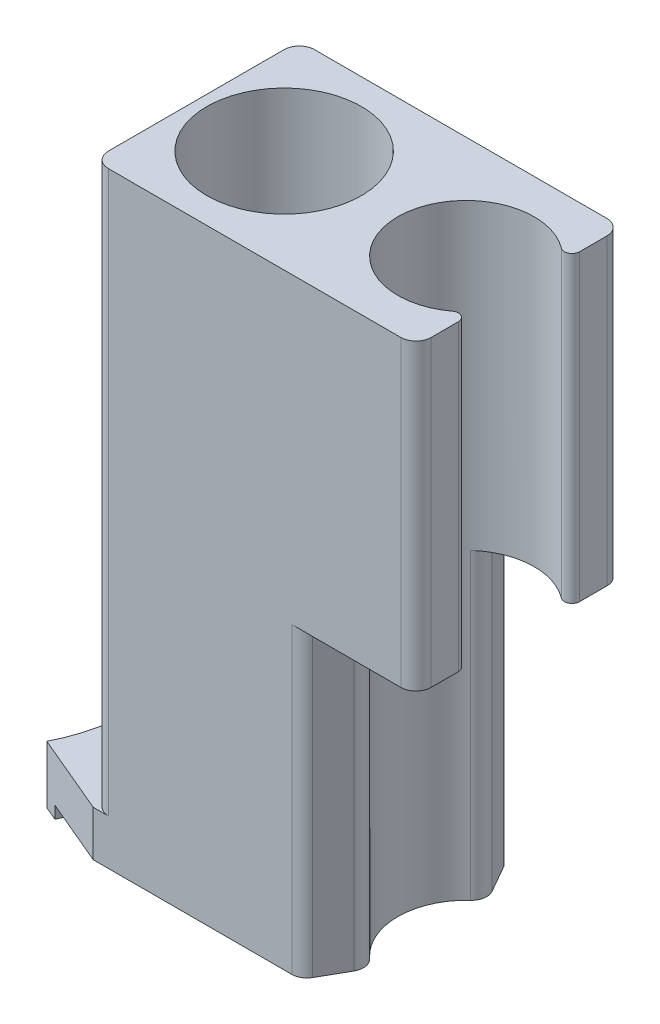
ISO-10303-21;
HEADER;
FILE_DESCRIPTION(('STEP AP214'),'2;1');
FILE_NAME('part.step','',(''),(''),'','','');
FILE_SCHEMA(('AUTOMOTIVE_DESIGN { 1 0 10303 214 1 1 1 1 }'));
ENDSEC;
DATA;
#1=APPLICATION_CONTEXT('core data for automotive mechanical design processes');
#2=APPLICATION_PROTOCOL_DEFINITION('international standard','automotive_design',2000,#1);
#3=PRODUCT_CONTEXT('',#1,'mechanical');
#4=PRODUCT('Part','Part','',(#3));
#5=PRODUCT_RELATED_PRODUCT_CATEGORY('part','',(#4));
#6=PRODUCT_DEFINITION_FORMATION('','',#4);
#7=PRODUCT_DEFINITION_CONTEXT('part definition',#1,'design');
#8=PRODUCT_DEFINITION('design','',#6,#7);
#9=PRODUCT_DEFINITION_SHAPE('','',#8);
#10=(LENGTH_UNIT() NAMED_UNIT(*) SI_UNIT(.MILLI.,.METRE.));
#11=(NAMED_UNIT(*) PLANE_ANGLE_UNIT() SI_UNIT($,.RADIAN.));
#12=(NAMED_UNIT(*) SI_UNIT($,.STERADIAN.) SOLID_ANGLE_UNIT());
#13=UNCERTAINTY_MEASURE_WITH_UNIT(LENGTH_MEASURE(1.E-05),#10,'distance_accuracy_value','');
#14=(GEOMETRIC_REPRESENTATION_CONTEXT(3) GLOBAL_UNCERTAINTY_ASSIGNED_CONTEXT((#13)) GLOBAL_UNIT_ASSIGNED_CONTEXT((#10,
#11,#12)) REPRESENTATION_CONTEXT('',''));
#15=CARTESIAN_POINT('',(0.,0.,0.));
#16=DIRECTION('',(0.,0.,1.));
#17=DIRECTION('',(1.,0.,0.));
#18=AXIS2_PLACEMENT_3D('',#15,#16,#17);
#19=CARTESIAN_POINT('',(0.,20.,0.));
#20=DIRECTION('',(0.,-1.,0.));
#21=DIRECTION('',(0.,0.,-1.));
#22=AXIS2_PLACEMENT_3D('',#19,#20,#21);
#23=PLANE('',#22);
#24=DIRECTION('',(0.,0.,-1.));
#25=VECTOR('',#24,1.);
#26=CARTESIAN_POINT('',(15.5,20.,0.));
#27=LINE('',#26,#25);
#28=CARTESIAN_POINT('',(15.5,20.,-4.));
#29=VERTEX_POINT('',#28);
#30=CARTESIAN_POINT('',(15.5,20.,-5.79999999999999));
#31=VERTEX_POINT('',#30);
#32=EDGE_CURVE('E294',#29,#31,#27,.T.);
#33=ORIENTED_EDGE('',*,*,#32,.F.);
#34=CARTESIAN_POINT('',(15.,20.,-4.));
#35=DIRECTION('',(0.,-1.,0.));
#36=DIRECTION('',(0.,0.,-1.));
#37=AXIS2_PLACEMENT_3D('',#34,#35,#36);
#38=CIRCLE('',#37,0.5);
#39=CARTESIAN_POINT('',(14.7,20.,-3.6));
#40=VERTEX_POINT('',#39);
#41=EDGE_CURVE('E11',#29,#40,#38,.T.);
#42=ORIENTED_EDGE('',*,*,#41,.T.);
#43=CARTESIAN_POINT('',(12.,20.,0.));
#44=DIRECTION('',(0.,-1.,0.));
#45=DIRECTION('',(0.,0.,-1.));
#46=AXIS2_PLACEMENT_3D('',#43,#44,#45);
#47=CIRCLE('',#46,4.5);
#48=CARTESIAN_POINT('',(8.96870597252041,20.,-3.32584673714327));
#49=VERTEX_POINT('',#48);
#50=EDGE_CURVE('E295',#49,#40,#47,.T.);
#51=ORIENTED_EDGE('',*,*,#50,.F.);
#52=CARTESIAN_POINT('',(8.29508507752494,20.,-4.06492378984178));
#53=DIRECTION('',(0.,-1.,0.));
#54=DIRECTION('',(0.,0.,-1.));
#55=AXIS2_PLACEMENT_3D('',#52,#53,#54);
#56=CIRCLE('',#55,1.);
#57=CARTESIAN_POINT('',(9.1633282196494,20.,-4.56106272819861));
#58=VERTEX_POINT('',#57);
#59=EDGE_CURVE('E368',#49,#58,#56,.F.);
#60=ORIENTED_EDGE('',*,*,#59,.T.);
#61=DIRECTION('',(-0.496138938356834,0.,-0.868243142124459));
#62=VECTOR('',#61,1.);
#63=CARTESIAN_POINT('',(7.88393549290576,20.,-6.79999999999999));
#64=LINE('',#63,#62);
#65=CARTESIAN_POINT('',(8.171856099559,20.,-6.29613893835683));
#66=VERTEX_POINT('',#65);
#67=EDGE_CURVE('E286',#58,#66,#64,.T.);
#68=ORIENTED_EDGE('',*,*,#67,.T.);
#69=CARTESIAN_POINT('',(7.30361295743454,20.,-5.79999999999999));
#70=DIRECTION('',(0.,-1.,0.));
#71=DIRECTION('',(0.,0.,-1.));
#72=AXIS2_PLACEMENT_3D('',#69,#70,#71);
#73=CIRCLE('',#72,1.);
#74=CARTESIAN_POINT('',(7.30361295743454,20.,-6.79999999999999));
#75=VERTEX_POINT('',#74);
#76=EDGE_CURVE('E370',#66,#75,#73,.F.);
#77=ORIENTED_EDGE('',*,*,#76,.T.);
#78=DIRECTION('',(-1.,0.,0.));
#79=VECTOR('',#78,1.);
#80=CARTESIAN_POINT('',(7.88393549290576,20.,-6.79999999999999));
#81=LINE('',#80,#79);
#82=CARTESIAN_POINT('',(14.5,20.,-6.79999999999999));
#83=VERTEX_POINT('',#82);
#84=EDGE_CURVE('E426',#83,#75,#81,.T.);
#85=ORIENTED_EDGE('',*,*,#84,.F.);
#86=CARTESIAN_POINT('',(14.5,20.,-5.79999999999999));
#87=DIRECTION('',(0.,-1.,0.));
#88=DIRECTION('',(0.,0.,-1.));
#89=AXIS2_PLACEMENT_3D('',#86,#87,#88);
#90=CIRCLE('',#89,1.);
#91=EDGE_CURVE('E342',#83,#31,#90,.T.);
#92=ORIENTED_EDGE('',*,*,#91,.T.);
#93=EDGE_LOOP('',(#33,#42,#51,#60,#68,#77,#85,#92));
#94=FACE_BOUND('',#93,.T.);
#95=ADVANCED_FACE('F41',(#94),#23,.T.);
#96=CARTESIAN_POINT('',(11.76964977862,107.802,0.));
#97=DIRECTION('',(0.868243142124459,0.,0.496138938356833));
#98=DIRECTION('',(0.496138938356833,0.,-0.868243142124459));
#99=AXIS2_PLACEMENT_3D('',#96,#97,#98);
#100=PLANE('',#99);
#101=DIRECTION('',(-0.496138938356833,0.,0.868243142124459));
#102=VECTOR('',#101,1.);
#103=CARTESIAN_POINT('',(11.76964977862,0.,0.));
#104=LINE('',#103,#102);
#105=CARTESIAN_POINT('',(9.16332821964941,0.,4.56106272819862));
#106=VERTEX_POINT('',#105);
#107=CARTESIAN_POINT('',(8.171856099559,0.,6.29613893835684));
#108=VERTEX_POINT('',#107);
#109=EDGE_CURVE('E263',#106,#108,#104,.T.);
#110=ORIENTED_EDGE('',*,*,#109,.F.);
#111=DIRECTION('',(0.,-1.,0.));
#112=VECTOR('',#111,1.);
#113=CARTESIAN_POINT('',(9.16332821964941,20.,4.56106272819862));
#114=LINE('',#113,#112);
#115=CARTESIAN_POINT('',(9.16332821964941,20.,4.56106272819862));
#116=VERTEX_POINT('',#115);
#117=EDGE_CURVE('E314',#106,#116,#114,.F.);
#118=ORIENTED_EDGE('',*,*,#117,.T.);
#119=DIRECTION('',(0.496138938356833,0.,-0.868243142124459));
#120=VECTOR('',#119,1.);
#121=CARTESIAN_POINT('',(11.76964977862,20.,0.));
#122=LINE('',#121,#120);
#123=CARTESIAN_POINT('',(8.171856099559,20.,6.29613893835684));
#124=VERTEX_POINT('',#123);
#125=EDGE_CURVE('E428',#124,#116,#122,.T.);
#126=ORIENTED_EDGE('',*,*,#125,.F.);
#127=DIRECTION('',(0.,-1.,0.));
#128=VECTOR('',#127,1.);
#129=CARTESIAN_POINT('',(8.171856099559,107.802,6.29613893835684));
#130=LINE('',#129,#128);
#131=EDGE_CURVE('E311',#124,#108,#130,.T.);
#132=ORIENTED_EDGE('',*,*,#131,.T.);
#133=EDGE_LOOP('',(#110,#118,#126,#132));
#134=FACE_BOUND('',#133,.T.);
#135=ADVANCED_FACE('F493',(#134),#100,.T.);
#136=CARTESIAN_POINT('',(7.88393549290576,107.802,6.80000000000001));
#137=DIRECTION('',(0.,0.,1.));
#138=DIRECTION('',(1.,0.,0.));
#139=AXIS2_PLACEMENT_3D('',#136,#137,#138);
#140=PLANE('',#139);
#141=DIRECTION('',(1.,0.,0.));
#142=VECTOR('',#141,1.);
#143=CARTESIAN_POINT('',(22.8839354929058,20.,6.80000000000001));
#144=LINE('',#143,#142);
#145=CARTESIAN_POINT('',(7.30361295743454,20.,6.80000000000001));
#146=VERTEX_POINT('',#145);
#147=CARTESIAN_POINT('',(14.5,20.,6.80000000000001));
#148=VERTEX_POINT('',#147);
#149=EDGE_CURVE('E423',#146,#148,#144,.T.);
#150=ORIENTED_EDGE('',*,*,#149,.T.);
#151=DIRECTION('',(0.,1.,0.));
#152=VECTOR('',#151,1.);
#153=CARTESIAN_POINT('',(14.5,40.,6.80000000000001));
#154=LINE('',#153,#152);
#155=CARTESIAN_POINT('',(14.5,40.,6.80000000000001));
#156=VERTEX_POINT('',#155);
#157=EDGE_CURVE('E353',#148,#156,#154,.T.);
#158=ORIENTED_EDGE('',*,*,#157,.T.);
#159=DIRECTION('',(1.,0.,0.));
#160=VECTOR('',#159,1.);
#161=CARTESIAN_POINT('',(7.88393549290576,40.,6.80000000000001));
#162=LINE('',#161,#160);
#163=CARTESIAN_POINT('',(-4.8,40.,6.80000000000001));
#164=VERTEX_POINT('',#163);
#165=EDGE_CURVE('E243',#164,#156,#162,.T.);
#166=ORIENTED_EDGE('',*,*,#165,.F.);
#167=DIRECTION('',(0.,-1.,0.));
#168=VECTOR('',#167,1.);
#169=CARTESIAN_POINT('',(-4.8,107.802,6.80000000000001));
#170=LINE('',#169,#168);
#171=CARTESIAN_POINT('',(-4.8,3.,6.80000000000001));
#172=VERTEX_POINT('',#171);
#173=EDGE_CURVE('E347',#164,#172,#170,.T.);
#174=ORIENTED_EDGE('',*,*,#173,.T.);
#175=DIRECTION('',(-1.,0.,0.));
#176=VECTOR('',#175,1.);
#177=CARTESIAN_POINT('',(7.88393549290576,3.,6.80000000000001));
#178=LINE('',#177,#176);
#179=CARTESIAN_POINT('',(-5.8,3.,6.80000000000001));
#180=VERTEX_POINT('',#179);
#181=EDGE_CURVE('E345',#172,#180,#178,.T.);
#182=ORIENTED_EDGE('',*,*,#181,.T.);
#183=DIRECTION('',(0.,1.,0.));
#184=VECTOR('',#183,1.);
#185=CARTESIAN_POINT('',(-5.8,0.,6.80000000000001));
#186=LINE('',#185,#184);
#187=CARTESIAN_POINT('',(-5.8,0.,6.80000000000001));
#188=VERTEX_POINT('',#187);
#189=EDGE_CURVE('E276',#188,#180,#186,.T.);
#190=ORIENTED_EDGE('',*,*,#189,.F.);
#191=DIRECTION('',(-1.,0.,0.));
#192=VECTOR('',#191,1.);
#193=CARTESIAN_POINT('',(7.88393549290576,0.,6.80000000000001));
#194=LINE('',#193,#192);
#195=CARTESIAN_POINT('',(7.30361295743454,0.,6.80000000000001));
#196=VERTEX_POINT('',#195);
#197=EDGE_CURVE('E266',#196,#188,#194,.T.);
#198=ORIENTED_EDGE('',*,*,#197,.F.);
#199=DIRECTION('',(0.,-1.,0.));
#200=VECTOR('',#199,1.);
#201=CARTESIAN_POINT('',(7.30361295743454,107.802,6.80000000000001));
#202=LINE('',#201,#200);
#203=EDGE_CURVE('E350',#196,#146,#202,.F.);
#204=ORIENTED_EDGE('',*,*,#203,.T.);
#205=EDGE_LOOP('',(#150,#158,#166,#174,#182,#190,#198,#204));
#206=FACE_BOUND('',#205,.T.);
#207=ADVANCED_FACE('F444',(#206),#140,.T.);
#208=CARTESIAN_POINT('',(7.88393549290576,107.802,-6.79999999999999));
#209=DIRECTION('',(0.868243142124459,0.,-0.496138938356834));
#210=DIRECTION('',(-0.496138938356834,0.,-0.868243142124459));
#211=AXIS2_PLACEMENT_3D('',#208,#209,#210);
#212=PLANE('',#211);
#213=ORIENTED_EDGE('',*,*,#67,.F.);
#214=DIRECTION('',(0.,-1.,0.));
#215=VECTOR('',#214,1.);
#216=CARTESIAN_POINT('',(9.1633282196494,0.,-4.56106272819861));
#217=LINE('',#216,#215);
#218=CARTESIAN_POINT('',(9.1633282196494,0.,-4.56106272819861));
#219=VERTEX_POINT('',#218);
#220=EDGE_CURVE('E318',#58,#219,#217,.T.);
#221=ORIENTED_EDGE('',*,*,#220,.T.);
#222=DIRECTION('',(0.496138938356834,0.,0.868243142124459));
#223=VECTOR('',#222,1.);
#224=CARTESIAN_POINT('',(7.88393549290576,0.,-6.79999999999999));
#225=LINE('',#224,#223);
#226=CARTESIAN_POINT('',(8.171856099559,0.,-6.29613893835683));
#227=VERTEX_POINT('',#226);
#228=EDGE_CURVE('E260',#227,#219,#225,.T.);
#229=ORIENTED_EDGE('',*,*,#228,.F.);
#230=DIRECTION('',(0.,-1.,0.));
#231=VECTOR('',#230,1.);
#232=CARTESIAN_POINT('',(8.171856099559,107.802,-6.29613893835683));
#233=LINE('',#232,#231);
#234=EDGE_CURVE('E316',#227,#66,#233,.F.);
#235=ORIENTED_EDGE('',*,*,#234,.T.);
#236=EDGE_LOOP('',(#213,#221,#229,#235));
#237=FACE_BOUND('',#236,.T.);
#238=ADVANCED_FACE('F475',(#237),#212,.T.);
#239=CARTESIAN_POINT('',(-5.8,107.802,6.80000000000001));
#240=DIRECTION('',(-1.,0.,0.));
#241=DIRECTION('',(0.,0.,1.));
#242=AXIS2_PLACEMENT_3D('',#239,#240,#241);
#243=PLANE('',#242);
#244=DIRECTION('',(0.,0.,1.));
#245=VECTOR('',#244,1.);
#246=CARTESIAN_POINT('',(-5.8,40.,6.80000000000001));
#247=LINE('',#246,#245);
#248=CARTESIAN_POINT('',(-5.8,40.,-5.79999999999999));
#249=VERTEX_POINT('',#248);
#250=CARTESIAN_POINT('',(-5.8,40.,5.80000000000001));
#251=VERTEX_POINT('',#250);
#252=EDGE_CURVE('E436',#249,#251,#247,.T.);
#253=ORIENTED_EDGE('',*,*,#252,.F.);
#254=DIRECTION('',(0.,-1.,0.));
#255=VECTOR('',#254,1.);
#256=CARTESIAN_POINT('',(-5.8,107.802,-5.79999999999999));
#257=LINE('',#256,#255);
#258=CARTESIAN_POINT('',(-5.8,3.,-5.79999999999999));
#259=VERTEX_POINT('',#258);
#260=EDGE_CURVE('E362',#249,#259,#257,.T.);
#261=ORIENTED_EDGE('',*,*,#260,.T.);
#262=DIRECTION('',(0.,0.,-1.));
#263=VECTOR('',#262,1.);
#264=CARTESIAN_POINT('',(-5.8,3.,6.80000000000001));
#265=LINE('',#264,#263);
#266=CARTESIAN_POINT('',(-5.8,3.,5.80000000000001));
#267=VERTEX_POINT('',#266);
#268=EDGE_CURVE('E223',#267,#259,#265,.T.);
#269=ORIENTED_EDGE('',*,*,#268,.F.);
#270=DIRECTION('',(0.,-1.,0.));
#271=VECTOR('',#270,1.);
#272=CARTESIAN_POINT('',(-5.8,107.802,5.80000000000001));
#273=LINE('',#272,#271);
#274=EDGE_CURVE('E360',#267,#251,#273,.F.);
#275=ORIENTED_EDGE('',*,*,#274,.T.);
#276=EDGE_LOOP('',(#253,#261,#269,#275));
#277=FACE_BOUND('',#276,.T.);
#278=ADVANCED_FACE('F552',(#277),#243,.T.);
#279=CARTESIAN_POINT('',(-5.8,107.802,-6.79999999999999));
#280=DIRECTION('',(0.,0.,-1.));
#281=DIRECTION('',(-1.,0.,0.));
#282=AXIS2_PLACEMENT_3D('',#279,#280,#281);
#283=PLANE('',#282);
#284=ORIENTED_EDGE('',*,*,#84,.T.);
#285=DIRECTION('',(0.,-1.,0.));
#286=VECTOR('',#285,1.);
#287=CARTESIAN_POINT('',(7.30361295743454,107.802,-6.79999999999999));
#288=LINE('',#287,#286);
#289=CARTESIAN_POINT('',(7.30361295743454,0.,-6.79999999999999));
#290=VERTEX_POINT('',#289);
#291=EDGE_CURVE('E327',#75,#290,#288,.T.);
#292=ORIENTED_EDGE('',*,*,#291,.T.);
#293=DIRECTION('',(1.,0.,0.));
#294=VECTOR('',#293,1.);
#295=CARTESIAN_POINT('',(-5.8,0.,-6.79999999999999));
#296=LINE('',#295,#294);
#297=CARTESIAN_POINT('',(-5.8,0.,-6.79999999999999));
#298=VERTEX_POINT('',#297);
#299=EDGE_CURVE('E256',#298,#290,#296,.T.);
#300=ORIENTED_EDGE('',*,*,#299,.F.);
#301=DIRECTION('',(0.,1.,0.));
#302=VECTOR('',#301,1.);
#303=CARTESIAN_POINT('',(-5.8,0.,-6.79999999999999));
#304=LINE('',#303,#302);
#305=CARTESIAN_POINT('',(-5.8,3.,-6.79999999999999));
#306=VERTEX_POINT('',#305);
#307=EDGE_CURVE('E224',#298,#306,#304,.T.);
#308=ORIENTED_EDGE('',*,*,#307,.T.);
#309=DIRECTION('',(1.,0.,0.));
#310=VECTOR('',#309,1.);
#311=CARTESIAN_POINT('',(-5.8,3.,-6.79999999999999));
#312=LINE('',#311,#310);
#313=CARTESIAN_POINT('',(-4.8,3.,-6.79999999999999));
#314=VERTEX_POINT('',#313);
#315=EDGE_CURVE('E322',#306,#314,#312,.T.);
#316=ORIENTED_EDGE('',*,*,#315,.T.);
#317=DIRECTION('',(0.,-1.,0.));
#318=VECTOR('',#317,1.);
#319=CARTESIAN_POINT('',(-4.8,107.802,-6.79999999999999));
#320=LINE('',#319,#318);
#321=CARTESIAN_POINT('',(-4.8,40.,-6.79999999999999));
#322=VERTEX_POINT('',#321);
#323=EDGE_CURVE('E320',#314,#322,#320,.F.);
#324=ORIENTED_EDGE('',*,*,#323,.T.);
#325=DIRECTION('',(-1.,0.,0.));
#326=VECTOR('',#325,1.);
#327=CARTESIAN_POINT('',(-5.8,40.,-6.79999999999999));
#328=LINE('',#327,#326);
#329=CARTESIAN_POINT('',(14.5,40.,-6.79999999999999));
#330=VERTEX_POINT('',#329);
#331=EDGE_CURVE('E283',#330,#322,#328,.T.);
#332=ORIENTED_EDGE('',*,*,#331,.F.);
#333=DIRECTION('',(0.,1.,0.));
#334=VECTOR('',#333,1.);
#335=CARTESIAN_POINT('',(14.5,20.,-6.79999999999999));
#336=LINE('',#335,#334);
#337=EDGE_CURVE('E325',#330,#83,#336,.F.);
#338=ORIENTED_EDGE('',*,*,#337,.T.);
#339=EDGE_LOOP('',(#284,#292,#300,#308,#316,#324,#332,#338));
#340=FACE_BOUND('',#339,.T.);
#341=ADVANCED_FACE('F467',(#340),#283,.T.);
#342=CARTESIAN_POINT('',(-20.,0.,0.));
#343=DIRECTION('',(0.,1.,0.));
#344=DIRECTION('',(0.,0.,1.));
#345=AXIS2_PLACEMENT_3D('',#342,#343,#344);
#346=CYLINDRICAL_SURFACE('',#345,10.);
#347=CARTESIAN_POINT('',(-20.,3.,0.));
#348=DIRECTION('',(0.,1.,0.));
#349=DIRECTION('',(0.,0.,1.));
#350=AXIS2_PLACEMENT_3D('',#347,#348,#349);
#351=CIRCLE('',#350,10.);
#352=CARTESIAN_POINT('',(-11.1,3.,4.5596052460712));
#353=VERTEX_POINT('',#352);
#354=CARTESIAN_POINT('',(-11.1,3.,-4.5596052460712));
#355=VERTEX_POINT('',#354);
#356=EDGE_CURVE('E220',#353,#355,#351,.T.);
#357=ORIENTED_EDGE('',*,*,#356,.T.);
#358=DIRECTION('',(0.,1.,0.));
#359=VECTOR('',#358,1.);
#360=CARTESIAN_POINT('',(-11.1,0.,-4.5596052460712));
#361=LINE('',#360,#359);
#362=CARTESIAN_POINT('',(-11.1,-0.799999999999995,-4.5596052460712));
#363=VERTEX_POINT('',#362);
#364=EDGE_CURVE('E213',#363,#355,#361,.T.);
#365=ORIENTED_EDGE('',*,*,#364,.F.);
#366=CARTESIAN_POINT('',(-20.,-0.799999999999995,0.));
#367=DIRECTION('',(0.,1.,0.));
#368=DIRECTION('',(0.,0.,1.));
#369=AXIS2_PLACEMENT_3D('',#366,#367,#368);
#370=CIRCLE('',#369,10.);
#371=CARTESIAN_POINT('',(-11.1,-0.799999999999995,4.5596052460712));
#372=VERTEX_POINT('',#371);
#373=EDGE_CURVE('E218',#372,#363,#370,.T.);
#374=ORIENTED_EDGE('',*,*,#373,.F.);
#375=DIRECTION('',(0.,1.,0.));
#376=VECTOR('',#375,1.);
#377=CARTESIAN_POINT('',(-11.1,0.,4.5596052460712));
#378=LINE('',#377,#376);
#379=EDGE_CURVE('E270',#372,#353,#378,.T.);
#380=ORIENTED_EDGE('',*,*,#379,.T.);
#381=EDGE_LOOP('',(#357,#365,#374,#380));
#382=FACE_BOUND('',#381,.T.);
#383=ADVANCED_FACE('F215',(#382),#346,.F.);
#384=CARTESIAN_POINT('',(-5.8,0.,-6.79999999999999));
#385=DIRECTION('',(0.38935799543113,0.,0.921086505923223));
#386=DIRECTION('',(0.921086505923223,0.,-0.38935799543113));
#387=AXIS2_PLACEMENT_3D('',#384,#385,#386);
#388=PLANE('',#387);
#389=DIRECTION('',(0.921086505923223,0.,-0.38935799543113));
#390=VECTOR('',#389,1.);
#391=CARTESIAN_POINT('',(-5.8,3.,-6.79999999999999));
#392=LINE('',#391,#390);
#393=EDGE_CURVE('E272',#355,#306,#392,.T.);
#394=ORIENTED_EDGE('',*,*,#393,.T.);
#395=ORIENTED_EDGE('',*,*,#307,.F.);
#396=DIRECTION('',(0.921086505923223,0.,-0.38935799543113));
#397=VECTOR('',#396,1.);
#398=CARTESIAN_POINT('',(-5.8,0.,-6.79999999999999));
#399=LINE('',#398,#397);
#400=CARTESIAN_POINT('',(-10.1766463825091,0.,-4.94992158581608));
#401=VERTEX_POINT('',#400);
#402=EDGE_CURVE('E254',#401,#298,#399,.T.);
#403=ORIENTED_EDGE('',*,*,#402,.F.);
#404=DIRECTION('',(0.,1.,0.));
#405=VECTOR('',#404,1.);
#406=CARTESIAN_POINT('',(-10.1766463825091,-0.799999999999995,-4.94992158581607));
#407=LINE('',#406,#405);
#408=CARTESIAN_POINT('',(-10.1766463825091,-0.799999999999995,-4.94992158581607));
#409=VERTEX_POINT('',#408);
#410=EDGE_CURVE('E231',#409,#401,#407,.T.);
#411=ORIENTED_EDGE('',*,*,#410,.F.);
#412=DIRECTION('',(0.921086505923224,0.,-0.389357995431129));
#413=VECTOR('',#412,1.);
#414=CARTESIAN_POINT('',(-11.1,-0.799999999999995,-4.5596052460712));
#415=LINE('',#414,#413);
#416=EDGE_CURVE('E227',#363,#409,#415,.T.);
#417=ORIENTED_EDGE('',*,*,#416,.F.);
#418=ORIENTED_EDGE('',*,*,#364,.T.);
#419=EDGE_LOOP('',(#394,#395,#403,#411,#417,#418));
#420=FACE_BOUND('',#419,.T.);
#421=ADVANCED_FACE('F228',(#420),#388,.F.);
#422=CARTESIAN_POINT('',(-11.1,0.,4.5596052460712));
#423=DIRECTION('',(0.389357995431133,0.,-0.921086505923222));
#424=DIRECTION('',(-0.921086505923222,0.,-0.389357995431133));
#425=AXIS2_PLACEMENT_3D('',#422,#423,#424);
#426=PLANE('',#425);
#427=DIRECTION('',(-0.921086505923222,0.,-0.389357995431133));
#428=VECTOR('',#427,1.);
#429=CARTESIAN_POINT('',(-11.1,3.,4.5596052460712));
#430=LINE('',#429,#428);
#431=EDGE_CURVE('E257',#180,#353,#430,.T.);
#432=ORIENTED_EDGE('',*,*,#431,.T.);
#433=ORIENTED_EDGE('',*,*,#379,.F.);
#434=DIRECTION('',(-0.921086505923222,0.,-0.389357995431132));
#435=VECTOR('',#434,1.);
#436=CARTESIAN_POINT('',(-11.1,-0.799999999999995,4.5596052460712));
#437=LINE('',#436,#435);
#438=CARTESIAN_POINT('',(-10.1766463825091,-0.799999999999995,4.94992158581608));
#439=VERTEX_POINT('',#438);
#440=EDGE_CURVE('E239',#439,#372,#437,.T.);
#441=ORIENTED_EDGE('',*,*,#440,.F.);
#442=DIRECTION('',(0.,1.,0.));
#443=VECTOR('',#442,1.);
#444=CARTESIAN_POINT('',(-10.1766463825091,-0.799999999999995,4.94992158581608));
#445=LINE('',#444,#443);
#446=CARTESIAN_POINT('',(-10.1766463825091,0.,4.94992158581608));
#447=VERTEX_POINT('',#446);
#448=EDGE_CURVE('E249',#439,#447,#445,.T.);
#449=ORIENTED_EDGE('',*,*,#448,.T.);
#450=DIRECTION('',(-0.921086505923222,0.,-0.389357995431133));
#451=VECTOR('',#450,1.);
#452=CARTESIAN_POINT('',(-11.1,0.,4.5596052460712));
#453=LINE('',#452,#451);
#454=EDGE_CURVE('E268',#188,#447,#453,.T.);
#455=ORIENTED_EDGE('',*,*,#454,.F.);
#456=ORIENTED_EDGE('',*,*,#189,.T.);
#457=EDGE_LOOP('',(#432,#433,#441,#449,#455,#456));
#458=FACE_BOUND('',#457,.T.);
#459=ADVANCED_FACE('F458',(#458),#426,.F.);
#460=CARTESIAN_POINT('',(-20.,0.,0.));
#461=DIRECTION('',(0.,1.,0.));
#462=DIRECTION('',(0.,0.,1.));
#463=AXIS2_PLACEMENT_3D('',#460,#461,#462);
#464=PLANE('',#463);
#465=CARTESIAN_POINT('',(0.,0.,0.));
#466=DIRECTION('',(0.,1.,0.));
#467=DIRECTION('',(0.,0.,1.));
#468=AXIS2_PLACEMENT_3D('',#465,#466,#467);
#469=CIRCLE('',#468,5.1);
#470=CARTESIAN_POINT('',(0.,0.,5.1));
#471=VERTEX_POINT('',#470);
#472=EDGE_CURVE('E434',#471,#471,#469,.T.);
#473=ORIENTED_EDGE('',*,*,#472,.T.);
#474=EDGE_LOOP('',(#473));
#475=FACE_BOUND('',#474,.T.);
#476=CARTESIAN_POINT('',(12.,0.,0.));
#477=DIRECTION('',(0.,1.,0.));
#478=DIRECTION('',(0.,0.,1.));
#479=AXIS2_PLACEMENT_3D('',#476,#477,#478);
#480=CIRCLE('',#479,4.5);
#481=CARTESIAN_POINT('',(8.96870597252041,0.,-3.32584673714327));
#482=VERTEX_POINT('',#481);
#483=CARTESIAN_POINT('',(8.96870597252042,0.,3.32584673714328));
#484=VERTEX_POINT('',#483);
#485=EDGE_CURVE('E420',#482,#484,#480,.T.);
#486=ORIENTED_EDGE('',*,*,#485,.T.);
#487=CARTESIAN_POINT('',(8.29508507752495,0.,4.06492378984179));
#488=DIRECTION('',(0.,1.,0.));
#489=DIRECTION('',(0.,0.,1.));
#490=AXIS2_PLACEMENT_3D('',#487,#488,#489);
#491=CIRCLE('',#490,1.);
#492=EDGE_CURVE('E309',#484,#106,#491,.F.);
#493=ORIENTED_EDGE('',*,*,#492,.T.);
#494=ORIENTED_EDGE('',*,*,#109,.T.);
#495=CARTESIAN_POINT('',(7.30361295743454,0.,5.80000000000001));
#496=DIRECTION('',(0.,1.,0.));
#497=DIRECTION('',(0.,0.,1.));
#498=AXIS2_PLACEMENT_3D('',#495,#496,#497);
#499=CIRCLE('',#498,1.);
#500=EDGE_CURVE('E303',#108,#196,#499,.F.);
#501=ORIENTED_EDGE('',*,*,#500,.T.);
#502=ORIENTED_EDGE('',*,*,#197,.T.);
#503=ORIENTED_EDGE('',*,*,#454,.T.);
#504=CARTESIAN_POINT('',(-20.,0.,0.));
#505=DIRECTION('',(0.,-1.,0.));
#506=DIRECTION('',(0.,0.,1.));
#507=AXIS2_PLACEMENT_3D('',#504,#505,#506);
#508=CIRCLE('',#507,11.);
#509=EDGE_CURVE('E240',#401,#447,#508,.T.);
#510=ORIENTED_EDGE('',*,*,#509,.F.);
#511=ORIENTED_EDGE('',*,*,#402,.T.);
#512=ORIENTED_EDGE('',*,*,#299,.T.);
#513=CARTESIAN_POINT('',(7.30361295743454,0.,-5.79999999999999));
#514=DIRECTION('',(0.,1.,0.));
#515=DIRECTION('',(0.,0.,1.));
#516=AXIS2_PLACEMENT_3D('',#513,#514,#515);
#517=CIRCLE('',#516,1.);
#518=EDGE_CURVE('E305',#290,#227,#517,.F.);
#519=ORIENTED_EDGE('',*,*,#518,.T.);
#520=ORIENTED_EDGE('',*,*,#228,.T.);
#521=CARTESIAN_POINT('',(8.29508507752494,0.,-4.06492378984178));
#522=DIRECTION('',(0.,1.,0.));
#523=DIRECTION('',(0.,0.,1.));
#524=AXIS2_PLACEMENT_3D('',#521,#522,#523);
#525=CIRCLE('',#524,1.);
#526=EDGE_CURVE('E307',#219,#482,#525,.F.);
#527=ORIENTED_EDGE('',*,*,#526,.T.);
#528=EDGE_LOOP('',(#486,#493,#494,#501,#502,#503,#510,#511,#512,#519,#520,#527));
#529=FACE_BOUND('',#528,.T.);
#530=ADVANCED_FACE('F461',(#475,#529),#464,.F.);
#531=CARTESIAN_POINT('',(-20.,3.,0.));
#532=DIRECTION('',(0.,1.,0.));
#533=DIRECTION('',(0.,0.,1.));
#534=AXIS2_PLACEMENT_3D('',#531,#532,#533);
#535=PLANE('',#534);
#536=ORIENTED_EDGE('',*,*,#431,.F.);
#537=ORIENTED_EDGE('',*,*,#181,.F.);
#538=CARTESIAN_POINT('',(-4.8,3.,5.80000000000001));
#539=DIRECTION('',(0.,1.,0.));
#540=DIRECTION('',(0.,0.,1.));
#541=AXIS2_PLACEMENT_3D('',#538,#539,#540);
#542=CIRCLE('',#541,1.);
#543=EDGE_CURVE('E377',#172,#267,#542,.F.);
#544=ORIENTED_EDGE('',*,*,#543,.T.);
#545=ORIENTED_EDGE('',*,*,#268,.T.);
#546=CARTESIAN_POINT('',(-4.8,3.,-5.79999999999999));
#547=DIRECTION('',(0.,1.,0.));
#548=DIRECTION('',(0.,0.,1.));
#549=AXIS2_PLACEMENT_3D('',#546,#547,#548);
#550=CIRCLE('',#549,1.);
#551=EDGE_CURVE('E375',#259,#314,#550,.F.);
#552=ORIENTED_EDGE('',*,*,#551,.T.);
#553=ORIENTED_EDGE('',*,*,#315,.F.);
#554=ORIENTED_EDGE('',*,*,#393,.F.);
#555=ORIENTED_EDGE('',*,*,#356,.F.);
#556=EDGE_LOOP('',(#536,#537,#544,#545,#552,#553,#554,#555));
#557=FACE_BOUND('',#556,.T.);
#558=ADVANCED_FACE('F453',(#557),#535,.T.);
#559=CARTESIAN_POINT('',(-20.,-0.799999999999995,0.));
#560=DIRECTION('',(0.,1.,0.));
#561=DIRECTION('',(0.,0.,1.));
#562=AXIS2_PLACEMENT_3D('',#559,#560,#561);
#563=CYLINDRICAL_SURFACE('',#562,11.);
#564=ORIENTED_EDGE('',*,*,#509,.T.);
#565=ORIENTED_EDGE('',*,*,#448,.F.);
#566=CARTESIAN_POINT('',(-20.,-0.799999999999995,0.));
#567=DIRECTION('',(0.,-1.,0.));
#568=DIRECTION('',(0.,0.,1.));
#569=AXIS2_PLACEMENT_3D('',#566,#567,#568);
#570=CIRCLE('',#569,11.);
#571=EDGE_CURVE('E234',#409,#439,#570,.T.);
#572=ORIENTED_EDGE('',*,*,#571,.F.);
#573=ORIENTED_EDGE('',*,*,#410,.T.);
#574=EDGE_LOOP('',(#564,#565,#572,#573));
#575=FACE_BOUND('',#574,.T.);
#576=ADVANCED_FACE('F463',(#575),#563,.T.);
#577=CARTESIAN_POINT('',(-20.,-0.799999999999995,0.));
#578=DIRECTION('',(0.,1.,0.));
#579=DIRECTION('',(0.,0.,1.));
#580=AXIS2_PLACEMENT_3D('',#577,#578,#579);
#581=PLANE('',#580);
#582=ORIENTED_EDGE('',*,*,#373,.T.);
#583=ORIENTED_EDGE('',*,*,#416,.T.);
#584=ORIENTED_EDGE('',*,*,#571,.T.);
#585=ORIENTED_EDGE('',*,*,#440,.T.);
#586=EDGE_LOOP('',(#582,#583,#584,#585));
#587=FACE_BOUND('',#586,.T.);
#588=ADVANCED_FACE('F237',(#587),#581,.F.);
#589=CARTESIAN_POINT('',(0.,40.,0.));
#590=DIRECTION('',(0.,-1.,0.));
#591=DIRECTION('',(0.,0.,-1.));
#592=AXIS2_PLACEMENT_3D('',#589,#590,#591);
#593=PLANE('',#592);
#594=CARTESIAN_POINT('',(0.,40.,0.));
#595=DIRECTION('',(0.,1.,0.));
#596=DIRECTION('',(0.,0.,1.));
#597=AXIS2_PLACEMENT_3D('',#594,#595,#596);
#598=CIRCLE('',#597,5.1);
#599=CARTESIAN_POINT('',(0.,40.,5.1));
#600=VERTEX_POINT('',#599);
#601=EDGE_CURVE('E431',#600,#600,#598,.T.);
#602=ORIENTED_EDGE('',*,*,#601,.F.);
#603=EDGE_LOOP('',(#602));
#604=FACE_BOUND('',#603,.T.);
#605=DIRECTION('',(0.,0.,1.));
#606=VECTOR('',#605,1.);
#607=CARTESIAN_POINT('',(15.5,40.,6.80000000000001));
#608=LINE('',#607,#606);
#609=CARTESIAN_POINT('',(15.5,40.,4.));
#610=VERTEX_POINT('',#609);
#611=CARTESIAN_POINT('',(15.5,40.,5.80000000000001));
#612=VERTEX_POINT('',#611);
#613=EDGE_CURVE('E411',#610,#612,#608,.T.);
#614=ORIENTED_EDGE('',*,*,#613,.F.);
#615=CARTESIAN_POINT('',(15.,40.,4.));
#616=DIRECTION('',(0.,-1.,0.));
#617=DIRECTION('',(0.,0.,-1.));
#618=AXIS2_PLACEMENT_3D('',#615,#616,#617);
#619=CIRCLE('',#618,0.5);
#620=CARTESIAN_POINT('',(14.7,40.,3.6));
#621=VERTEX_POINT('',#620);
#622=EDGE_CURVE('E384',#610,#621,#619,.F.);
#623=ORIENTED_EDGE('',*,*,#622,.T.);
#624=CARTESIAN_POINT('',(12.,40.,0.));
#625=DIRECTION('',(0.,1.,0.));
#626=DIRECTION('',(0.,0.,1.));
#627=AXIS2_PLACEMENT_3D('',#624,#625,#626);
#628=CIRCLE('',#627,4.5);
#629=CARTESIAN_POINT('',(14.7,40.,-3.6));
#630=VERTEX_POINT('',#629);
#631=EDGE_CURVE('E410',#630,#621,#628,.T.);
#632=ORIENTED_EDGE('',*,*,#631,.F.);
#633=CARTESIAN_POINT('',(15.,40.,-4.));
#634=DIRECTION('',(0.,-1.,0.));
#635=DIRECTION('',(0.,0.,-1.));
#636=AXIS2_PLACEMENT_3D('',#633,#634,#635);
#637=CIRCLE('',#636,0.5);
#638=CARTESIAN_POINT('',(15.5,40.,-4.));
#639=VERTEX_POINT('',#638);
#640=EDGE_CURVE('E382',#630,#639,#637,.F.);
#641=ORIENTED_EDGE('',*,*,#640,.T.);
#642=DIRECTION('',(0.,0.,1.));
#643=VECTOR('',#642,1.);
#644=CARTESIAN_POINT('',(15.5,40.,-2.82842712474619));
#645=LINE('',#644,#643);
#646=CARTESIAN_POINT('',(15.5,40.,-5.79999999999999));
#647=VERTEX_POINT('',#646);
#648=EDGE_CURVE('E416',#647,#639,#645,.T.);
#649=ORIENTED_EDGE('',*,*,#648,.F.);
#650=CARTESIAN_POINT('',(14.5,40.,-5.79999999999999));
#651=DIRECTION('',(0.,-1.,0.));
#652=DIRECTION('',(0.,0.,-1.));
#653=AXIS2_PLACEMENT_3D('',#650,#651,#652);
#654=CIRCLE('',#653,1.);
#655=EDGE_CURVE('E340',#647,#330,#654,.F.);
#656=ORIENTED_EDGE('',*,*,#655,.T.);
#657=ORIENTED_EDGE('',*,*,#331,.T.);
#658=CARTESIAN_POINT('',(-4.8,40.,-5.79999999999999));
#659=DIRECTION('',(0.,-1.,0.));
#660=DIRECTION('',(0.,0.,-1.));
#661=AXIS2_PLACEMENT_3D('',#658,#659,#660);
#662=CIRCLE('',#661,1.);
#663=EDGE_CURVE('E335',#322,#249,#662,.F.);
#664=ORIENTED_EDGE('',*,*,#663,.T.);
#665=ORIENTED_EDGE('',*,*,#252,.T.);
#666=CARTESIAN_POINT('',(-4.8,40.,5.80000000000001));
#667=DIRECTION('',(0.,-1.,0.));
#668=DIRECTION('',(0.,0.,-1.));
#669=AXIS2_PLACEMENT_3D('',#666,#667,#668);
#670=CIRCLE('',#669,1.);
#671=EDGE_CURVE('E333',#251,#164,#670,.F.);
#672=ORIENTED_EDGE('',*,*,#671,.T.);
#673=ORIENTED_EDGE('',*,*,#165,.T.);
#674=CARTESIAN_POINT('',(14.5,40.,5.80000000000001));
#675=DIRECTION('',(0.,-1.,0.));
#676=DIRECTION('',(0.,0.,-1.));
#677=AXIS2_PLACEMENT_3D('',#674,#675,#676);
#678=CIRCLE('',#677,1.);
#679=EDGE_CURVE('E337',#156,#612,#678,.F.);
#680=ORIENTED_EDGE('',*,*,#679,.T.);
#681=EDGE_LOOP('',(#614,#623,#632,#641,#649,#656,#657,#664,#665,#672,#673,#680));
#682=FACE_BOUND('',#681,.T.);
#683=ADVANCED_FACE('F409',(#604,#682),#593,.F.);
#684=CARTESIAN_POINT('',(0.,-0.799999999999995,0.));
#685=DIRECTION('',(0.,1.,0.));
#686=DIRECTION('',(0.,0.,1.));
#687=AXIS2_PLACEMENT_3D('',#684,#685,#686);
#688=CYLINDRICAL_SURFACE('',#687,5.1);
#689=ORIENTED_EDGE('',*,*,#601,.T.);
#690=EDGE_LOOP('',(#689));
#691=FACE_BOUND('',#690,.T.);
#692=ORIENTED_EDGE('',*,*,#472,.F.);
#693=EDGE_LOOP('',(#692));
#694=FACE_BOUND('',#693,.T.);
#695=ADVANCED_FACE('F522',(#691,#694),#688,.F.);
#696=CARTESIAN_POINT('',(14.7,20.,3.6));
#697=VERTEX_POINT('',#696);
#698=CARTESIAN_POINT('',(8.96870597252042,20.,3.32584673714328));
#699=VERTEX_POINT('',#698);
#700=EDGE_CURVE('E292',#697,#699,#47,.T.);
#701=ORIENTED_EDGE('',*,*,#700,.F.);
#702=CARTESIAN_POINT('',(15.,20.,4.));
#703=DIRECTION('',(0.,-1.,0.));
#704=DIRECTION('',(0.,0.,-1.));
#705=AXIS2_PLACEMENT_3D('',#702,#703,#704);
#706=CIRCLE('',#705,0.5);
#707=CARTESIAN_POINT('',(15.5,20.,4.));
#708=VERTEX_POINT('',#707);
#709=EDGE_CURVE('E391',#697,#708,#706,.T.);
#710=ORIENTED_EDGE('',*,*,#709,.T.);
#711=DIRECTION('',(0.,0.,-1.));
#712=VECTOR('',#711,1.);
#713=CARTESIAN_POINT('',(15.5,20.,0.));
#714=LINE('',#713,#712);
#715=CARTESIAN_POINT('',(15.5,20.,5.80000000000001));
#716=VERTEX_POINT('',#715);
#717=EDGE_CURVE('E289',#716,#708,#714,.T.);
#718=ORIENTED_EDGE('',*,*,#717,.F.);
#719=CARTESIAN_POINT('',(14.5,20.,5.80000000000001));
#720=DIRECTION('',(0.,-1.,0.));
#721=DIRECTION('',(0.,0.,-1.));
#722=AXIS2_PLACEMENT_3D('',#719,#720,#721);
#723=CIRCLE('',#722,1.);
#724=EDGE_CURVE('E358',#716,#148,#723,.T.);
#725=ORIENTED_EDGE('',*,*,#724,.T.);
#726=ORIENTED_EDGE('',*,*,#149,.F.);
#727=CARTESIAN_POINT('',(7.30361295743454,20.,5.80000000000001));
#728=DIRECTION('',(0.,-1.,0.));
#729=DIRECTION('',(0.,0.,-1.));
#730=AXIS2_PLACEMENT_3D('',#727,#728,#729);
#731=CIRCLE('',#730,1.);
#732=EDGE_CURVE('E373',#146,#124,#731,.F.);
#733=ORIENTED_EDGE('',*,*,#732,.T.);
#734=ORIENTED_EDGE('',*,*,#125,.T.);
#735=CARTESIAN_POINT('',(8.29508507752495,20.,4.06492378984179));
#736=DIRECTION('',(0.,-1.,0.));
#737=DIRECTION('',(0.,0.,-1.));
#738=AXIS2_PLACEMENT_3D('',#735,#736,#737);
#739=CIRCLE('',#738,1.);
#740=EDGE_CURVE('E365',#116,#699,#739,.F.);
#741=ORIENTED_EDGE('',*,*,#740,.T.);
#742=EDGE_LOOP('',(#701,#710,#718,#725,#726,#733,#734,#741));
#743=FACE_BOUND('',#742,.T.);
#744=ADVANCED_FACE('F396',(#743),#23,.T.);
#745=CARTESIAN_POINT('',(12.,-0.799999999999995,0.));
#746=DIRECTION('',(0.,1.,0.));
#747=DIRECTION('',(0.,0.,1.));
#748=AXIS2_PLACEMENT_3D('',#745,#746,#747);
#749=CYLINDRICAL_SURFACE('',#748,4.5);
#750=ORIENTED_EDGE('',*,*,#631,.T.);
#751=DIRECTION('',(0.,1.,0.));
#752=VECTOR('',#751,1.);
#753=CARTESIAN_POINT('',(14.7,-0.799999999999995,3.6));
#754=LINE('',#753,#752);
#755=EDGE_CURVE('E389',#621,#697,#754,.F.);
#756=ORIENTED_EDGE('',*,*,#755,.T.);
#757=ORIENTED_EDGE('',*,*,#700,.T.);
#758=DIRECTION('',(0.,1.,0.));
#759=VECTOR('',#758,1.);
#760=CARTESIAN_POINT('',(8.96870597252042,-0.799999999999995,3.32584673714328));
#761=LINE('',#760,#759);
#762=EDGE_CURVE('E300',#699,#484,#761,.F.);
#763=ORIENTED_EDGE('',*,*,#762,.T.);
#764=ORIENTED_EDGE('',*,*,#485,.F.);
#765=DIRECTION('',(0.,1.,0.));
#766=VECTOR('',#765,1.);
#767=CARTESIAN_POINT('',(8.96870597252041,-0.799999999999995,-3.32584673714327));
#768=LINE('',#767,#766);
#769=EDGE_CURVE('E297',#482,#49,#768,.T.);
#770=ORIENTED_EDGE('',*,*,#769,.T.);
#771=ORIENTED_EDGE('',*,*,#50,.T.);
#772=DIRECTION('',(0.,1.,0.));
#773=VECTOR('',#772,1.);
#774=CARTESIAN_POINT('',(14.7,-0.799999999999995,-3.6));
#775=LINE('',#774,#773);
#776=EDGE_CURVE('E386',#40,#630,#775,.T.);
#777=ORIENTED_EDGE('',*,*,#776,.T.);
#778=EDGE_LOOP('',(#750,#756,#757,#763,#764,#770,#771,#777));
#779=FACE_BOUND('',#778,.T.);
#780=ADVANCED_FACE('F413',(#779),#749,.F.);
#781=CARTESIAN_POINT('',(15.5,-0.799999999999995,-2.82842712474619));
#782=DIRECTION('',(-1.,0.,0.));
#783=DIRECTION('',(0.,0.,1.));
#784=AXIS2_PLACEMENT_3D('',#781,#782,#783);
#785=PLANE('',#784);
#786=ORIENTED_EDGE('',*,*,#648,.T.);
#787=DIRECTION('',(0.,1.,0.));
#788=VECTOR('',#787,1.);
#789=CARTESIAN_POINT('',(15.5,-0.799999999999995,-4.));
#790=LINE('',#789,#788);
#791=EDGE_CURVE('E49',#639,#29,#790,.F.);
#792=ORIENTED_EDGE('',*,*,#791,.T.);
#793=ORIENTED_EDGE('',*,*,#32,.T.);
#794=DIRECTION('',(0.,1.,0.));
#795=VECTOR('',#794,1.);
#796=CARTESIAN_POINT('',(15.5,40.,-5.79999999999999));
#797=LINE('',#796,#795);
#798=EDGE_CURVE('E330',#31,#647,#797,.T.);
#799=ORIENTED_EDGE('',*,*,#798,.T.);
#800=EDGE_LOOP('',(#786,#792,#793,#799));
#801=FACE_BOUND('',#800,.T.);
#802=ADVANCED_FACE('F527',(#801),#785,.F.);
#803=CARTESIAN_POINT('',(15.5,-0.799999999999995,6.80000000000001));
#804=DIRECTION('',(-1.,0.,0.));
#805=DIRECTION('',(0.,0.,1.));
#806=AXIS2_PLACEMENT_3D('',#803,#804,#805);
#807=PLANE('',#806);
#808=ORIENTED_EDGE('',*,*,#717,.T.);
#809=DIRECTION('',(0.,1.,0.));
#810=VECTOR('',#809,1.);
#811=CARTESIAN_POINT('',(15.5,-0.799999999999995,4.));
#812=LINE('',#811,#810);
#813=EDGE_CURVE('E379',#708,#610,#812,.T.);
#814=ORIENTED_EDGE('',*,*,#813,.T.);
#815=ORIENTED_EDGE('',*,*,#613,.T.);
#816=DIRECTION('',(0.,1.,0.));
#817=VECTOR('',#816,1.);
#818=CARTESIAN_POINT('',(15.5,20.,5.80000000000001));
#819=LINE('',#818,#817);
#820=EDGE_CURVE('E356',#612,#716,#819,.F.);
#821=ORIENTED_EDGE('',*,*,#820,.T.);
#822=EDGE_LOOP('',(#808,#814,#815,#821));
#823=FACE_BOUND('',#822,.T.);
#824=ADVANCED_FACE('F402',(#823),#807,.F.);
#825=CARTESIAN_POINT('',(8.29508507752495,-0.799999999999995,4.06492378984179));
#826=DIRECTION('',(0.,1.,0.));
#827=DIRECTION('',(0.,0.,1.));
#828=AXIS2_PLACEMENT_3D('',#825,#826,#827);
#829=CYLINDRICAL_SURFACE('',#828,1.);
#830=ORIENTED_EDGE('',*,*,#740,.F.);
#831=ORIENTED_EDGE('',*,*,#117,.F.);
#832=ORIENTED_EDGE('',*,*,#492,.F.);
#833=ORIENTED_EDGE('',*,*,#762,.F.);
#834=EDGE_LOOP('',(#830,#831,#832,#833));
#835=FACE_BOUND('',#834,.T.);
#836=ADVANCED_FACE('F489',(#835),#829,.T.);
#837=CARTESIAN_POINT('',(8.29508507752494,-0.799999999999995,-4.06492378984178));
#838=DIRECTION('',(0.,1.,0.));
#839=DIRECTION('',(0.,0.,1.));
#840=AXIS2_PLACEMENT_3D('',#837,#838,#839);
#841=CYLINDRICAL_SURFACE('',#840,1.);
#842=ORIENTED_EDGE('',*,*,#526,.F.);
#843=ORIENTED_EDGE('',*,*,#220,.F.);
#844=ORIENTED_EDGE('',*,*,#59,.F.);
#845=ORIENTED_EDGE('',*,*,#769,.F.);
#846=EDGE_LOOP('',(#842,#843,#844,#845));
#847=FACE_BOUND('',#846,.T.);
#848=ADVANCED_FACE('F483',(#847),#841,.T.);
#849=CARTESIAN_POINT('',(7.30361295743454,107.802,-5.79999999999999));
#850=DIRECTION('',(0.,-1.,0.));
#851=DIRECTION('',(0.,0.,-1.));
#852=AXIS2_PLACEMENT_3D('',#849,#850,#851);
#853=CYLINDRICAL_SURFACE('',#852,1.);
#854=ORIENTED_EDGE('',*,*,#76,.F.);
#855=ORIENTED_EDGE('',*,*,#234,.F.);
#856=ORIENTED_EDGE('',*,*,#518,.F.);
#857=ORIENTED_EDGE('',*,*,#291,.F.);
#858=EDGE_LOOP('',(#854,#855,#856,#857));
#859=FACE_BOUND('',#858,.T.);
#860=ADVANCED_FACE('F478',(#859),#853,.T.);
#861=CARTESIAN_POINT('',(14.5,-0.799999999999995,-5.79999999999999));
#862=DIRECTION('',(0.,-1.,0.));
#863=DIRECTION('',(0.,0.,-1.));
#864=AXIS2_PLACEMENT_3D('',#861,#862,#863);
#865=CYLINDRICAL_SURFACE('',#864,1.);
#866=ORIENTED_EDGE('',*,*,#91,.F.);
#867=ORIENTED_EDGE('',*,*,#337,.F.);
#868=ORIENTED_EDGE('',*,*,#655,.F.);
#869=ORIENTED_EDGE('',*,*,#798,.F.);
#870=EDGE_LOOP('',(#866,#867,#868,#869));
#871=FACE_BOUND('',#870,.T.);
#872=ADVANCED_FACE('F503',(#871),#865,.T.);
#873=CARTESIAN_POINT('',(14.5,107.802,5.80000000000001));
#874=DIRECTION('',(0.,-1.,0.));
#875=DIRECTION('',(0.,0.,-1.));
#876=AXIS2_PLACEMENT_3D('',#873,#874,#875);
#877=CYLINDRICAL_SURFACE('',#876,1.);
#878=ORIENTED_EDGE('',*,*,#724,.F.);
#879=ORIENTED_EDGE('',*,*,#820,.F.);
#880=ORIENTED_EDGE('',*,*,#679,.F.);
#881=ORIENTED_EDGE('',*,*,#157,.F.);
#882=EDGE_LOOP('',(#878,#879,#880,#881));
#883=FACE_BOUND('',#882,.T.);
#884=ADVANCED_FACE('F501',(#883),#877,.T.);
#885=CARTESIAN_POINT('',(7.30361295743454,107.802,5.80000000000001));
#886=DIRECTION('',(0.,-1.,0.));
#887=DIRECTION('',(0.,0.,-1.));
#888=AXIS2_PLACEMENT_3D('',#885,#886,#887);
#889=CYLINDRICAL_SURFACE('',#888,1.);
#890=ORIENTED_EDGE('',*,*,#732,.F.);
#891=ORIENTED_EDGE('',*,*,#203,.F.);
#892=ORIENTED_EDGE('',*,*,#500,.F.);
#893=ORIENTED_EDGE('',*,*,#131,.F.);
#894=EDGE_LOOP('',(#890,#891,#892,#893));
#895=FACE_BOUND('',#894,.T.);
#896=ADVANCED_FACE('F498',(#895),#889,.T.);
#897=CARTESIAN_POINT('',(-4.8,107.802,-5.79999999999999));
#898=DIRECTION('',(0.,-1.,0.));
#899=DIRECTION('',(0.,0.,-1.));
#900=AXIS2_PLACEMENT_3D('',#897,#898,#899);
#901=CYLINDRICAL_SURFACE('',#900,1.);
#902=ORIENTED_EDGE('',*,*,#663,.F.);
#903=ORIENTED_EDGE('',*,*,#323,.F.);
#904=ORIENTED_EDGE('',*,*,#551,.F.);
#905=ORIENTED_EDGE('',*,*,#260,.F.);
#906=EDGE_LOOP('',(#902,#903,#904,#905));
#907=FACE_BOUND('',#906,.T.);
#908=ADVANCED_FACE('F509',(#907),#901,.T.);
#909=CARTESIAN_POINT('',(-4.8,107.802,5.80000000000001));
#910=DIRECTION('',(0.,-1.,0.));
#911=DIRECTION('',(0.,0.,-1.));
#912=AXIS2_PLACEMENT_3D('',#909,#910,#911);
#913=CYLINDRICAL_SURFACE('',#912,1.);
#914=ORIENTED_EDGE('',*,*,#671,.F.);
#915=ORIENTED_EDGE('',*,*,#274,.F.);
#916=ORIENTED_EDGE('',*,*,#543,.F.);
#917=ORIENTED_EDGE('',*,*,#173,.F.);
#918=EDGE_LOOP('',(#914,#915,#916,#917));
#919=FACE_BOUND('',#918,.T.);
#920=ADVANCED_FACE('F447',(#919),#913,.T.);
#921=CARTESIAN_POINT('',(15.,-0.799999999999995,4.));
#922=DIRECTION('',(0.,1.,0.));
#923=DIRECTION('',(0.,0.,1.));
#924=AXIS2_PLACEMENT_3D('',#921,#922,#923);
#925=CYLINDRICAL_SURFACE('',#924,0.5);
#926=ORIENTED_EDGE('',*,*,#709,.F.);
#927=ORIENTED_EDGE('',*,*,#755,.F.);
#928=ORIENTED_EDGE('',*,*,#622,.F.);
#929=ORIENTED_EDGE('',*,*,#813,.F.);
#930=EDGE_LOOP('',(#926,#927,#928,#929));
#931=FACE_BOUND('',#930,.T.);
#932=ADVANCED_FACE('F405',(#931),#925,.T.);
#933=CARTESIAN_POINT('',(15.,-0.799999999999995,-4.));
#934=DIRECTION('',(0.,1.,0.));
#935=DIRECTION('',(0.,0.,1.));
#936=AXIS2_PLACEMENT_3D('',#933,#934,#935);
#937=CYLINDRICAL_SURFACE('',#936,0.5);
#938=ORIENTED_EDGE('',*,*,#41,.F.);
#939=ORIENTED_EDGE('',*,*,#791,.F.);
#940=ORIENTED_EDGE('',*,*,#640,.F.);
#941=ORIENTED_EDGE('',*,*,#776,.F.);
#942=EDGE_LOOP('',(#938,#939,#940,#941));
#943=FACE_BOUND('',#942,.T.);
#944=ADVANCED_FACE('F43',(#943),#937,.T.);
#945=CLOSED_SHELL('',(#95,#135,#207,#238,#278,#341,#383,#421,#459,#530,#558,#576,#588,#683,#695,
#744,#780,#802,#824,#836,#848,#860,#872,#884,#896,#908,#920,#932,#944));
#946=MANIFOLD_SOLID_BREP('B2',#945);
#947=ADVANCED_BREP_SHAPE_REPRESENTATION('',(#18,#946),#14);
#948=SHAPE_DEFINITION_REPRESENTATION(#9,#947);
ENDSEC;
END-ISO-10303-21;
